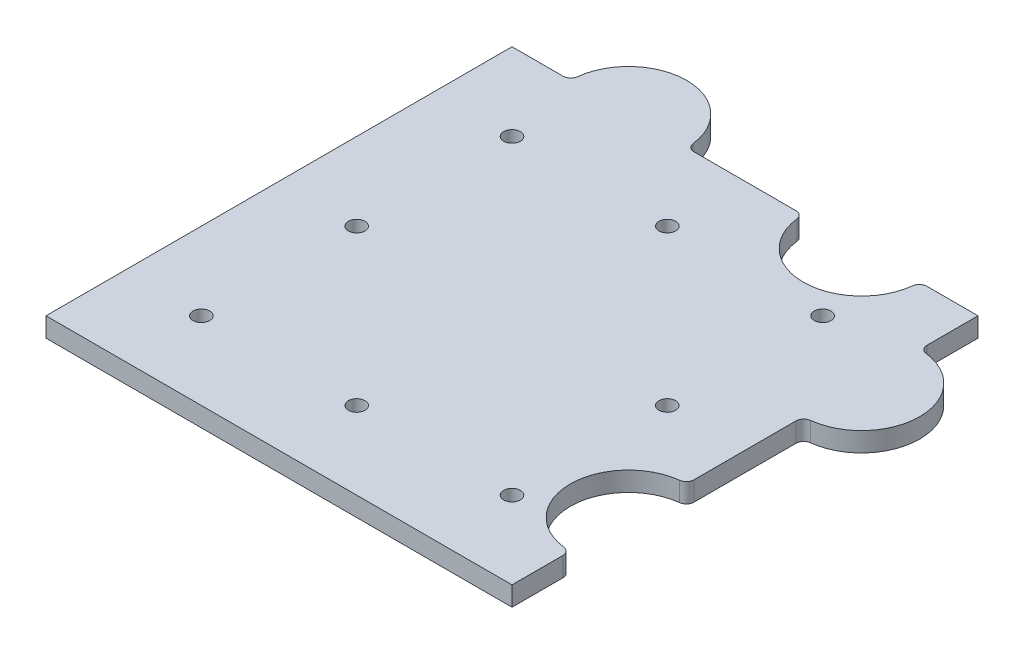
ISO-10303-21;
HEADER;
FILE_DESCRIPTION(('STEP AP214'),'2;1');
FILE_NAME('part.step','',(''),(''),'','','');
FILE_SCHEMA(('AUTOMOTIVE_DESIGN { 1 0 10303 214 1 1 1 1 }'));
ENDSEC;
DATA;
#1=APPLICATION_CONTEXT('core data for automotive mechanical design processes');
#2=APPLICATION_PROTOCOL_DEFINITION('international standard','automotive_design',2000,#1);
#3=PRODUCT_CONTEXT('',#1,'mechanical');
#4=PRODUCT('Part','Part','',(#3));
#5=PRODUCT_RELATED_PRODUCT_CATEGORY('part','',(#4));
#6=PRODUCT_DEFINITION_FORMATION('','',#4);
#7=PRODUCT_DEFINITION_CONTEXT('part definition',#1,'design');
#8=PRODUCT_DEFINITION('design','',#6,#7);
#9=PRODUCT_DEFINITION_SHAPE('','',#8);
#10=(LENGTH_UNIT() NAMED_UNIT(*) SI_UNIT(.MILLI.,.METRE.));
#11=(NAMED_UNIT(*) PLANE_ANGLE_UNIT() SI_UNIT($,.RADIAN.));
#12=(NAMED_UNIT(*) SI_UNIT($,.STERADIAN.) SOLID_ANGLE_UNIT());
#13=UNCERTAINTY_MEASURE_WITH_UNIT(LENGTH_MEASURE(1.E-05),#10,'distance_accuracy_value','');
#14=(GEOMETRIC_REPRESENTATION_CONTEXT(3) GLOBAL_UNCERTAINTY_ASSIGNED_CONTEXT((#13)) GLOBAL_UNIT_ASSIGNED_CONTEXT((#10,
#11,#12)) REPRESENTATION_CONTEXT('',''));
#15=CARTESIAN_POINT('',(0.,0.,0.));
#16=DIRECTION('',(0.,0.,1.));
#17=DIRECTION('',(1.,0.,0.));
#18=AXIS2_PLACEMENT_3D('',#15,#16,#17);
#19=CARTESIAN_POINT('',(-30.,5.,-60.));
#20=DIRECTION('',(0.,-1.,0.));
#21=DIRECTION('',(0.,0.,-1.));
#22=AXIS2_PLACEMENT_3D('',#19,#20,#21);
#23=PLANE('',#22);
#24=CARTESIAN_POINT('',(30.,5.,-60.));
#25=DIRECTION('',(0.,-1.,0.));
#26=DIRECTION('',(0.,0.,1.));
#27=AXIS2_PLACEMENT_3D('',#24,#25,#26);
#28=CIRCLE('',#27,15.);
#29=CARTESIAN_POINT('',(44.8958320730595,5.,-58.2352941176471));
#30=VERTEX_POINT('',#29);
#31=CARTESIAN_POINT('',(15.1041679269405,5.,-58.2352941176471));
#32=VERTEX_POINT('',#31);
#33=EDGE_CURVE('E208',#30,#32,#28,.T.);
#34=ORIENTED_EDGE('',*,*,#33,.T.);
#35=CARTESIAN_POINT('',(13.1180569838659,5.,-58.));
#36=DIRECTION('',(0.,-1.,0.));
#37=DIRECTION('',(0.,0.,-1.));
#38=AXIS2_PLACEMENT_3D('',#35,#36,#37);
#39=CIRCLE('',#38,2.);
#40=CARTESIAN_POINT('',(13.1180569838659,5.,-60.));
#41=VERTEX_POINT('',#40);
#42=EDGE_CURVE('E331',#32,#41,#39,.F.);
#43=ORIENTED_EDGE('',*,*,#42,.T.);
#44=DIRECTION('',(-1.,0.,0.));
#45=VECTOR('',#44,1.);
#46=CARTESIAN_POINT('',(-15.,5.,-60.));
#47=LINE('',#46,#45);
#48=CARTESIAN_POINT('',(-13.1180569838659,5.,-60.));
#49=VERTEX_POINT('',#48);
#50=EDGE_CURVE('E211',#41,#49,#47,.T.);
#51=ORIENTED_EDGE('',*,*,#50,.T.);
#52=CARTESIAN_POINT('',(-13.1180569838659,5.,-62.));
#53=DIRECTION('',(0.,-1.,0.));
#54=DIRECTION('',(0.,0.,-1.));
#55=AXIS2_PLACEMENT_3D('',#52,#53,#54);
#56=CIRCLE('',#55,2.);
#57=CARTESIAN_POINT('',(-15.1041679269405,5.,-61.7647058823529));
#58=VERTEX_POINT('',#57);
#59=EDGE_CURVE('E372',#49,#58,#56,.T.);
#60=ORIENTED_EDGE('',*,*,#59,.T.);
#61=CARTESIAN_POINT('',(-30.,5.,-60.));
#62=DIRECTION('',(0.,1.,0.));
#63=DIRECTION('',(0.,0.,-1.));
#64=AXIS2_PLACEMENT_3D('',#61,#62,#63);
#65=CIRCLE('',#64,15.);
#66=CARTESIAN_POINT('',(-44.8958320730595,5.,-61.7647058823529));
#67=VERTEX_POINT('',#66);
#68=EDGE_CURVE('E218',#58,#67,#65,.T.);
#69=ORIENTED_EDGE('',*,*,#68,.T.);
#70=CARTESIAN_POINT('',(-46.8819430161341,5.,-62.));
#71=DIRECTION('',(0.,-1.,0.));
#72=DIRECTION('',(0.,0.,-1.));
#73=AXIS2_PLACEMENT_3D('',#70,#71,#72);
#74=CIRCLE('',#73,2.);
#75=CARTESIAN_POINT('',(-46.8819430161341,5.,-60.));
#76=VERTEX_POINT('',#75);
#77=EDGE_CURVE('E366',#67,#76,#74,.T.);
#78=ORIENTED_EDGE('',*,*,#77,.T.);
#79=DIRECTION('',(-1.,0.,0.));
#80=VECTOR('',#79,1.);
#81=CARTESIAN_POINT('',(-60.,5.,-60.));
#82=LINE('',#81,#80);
#83=CARTESIAN_POINT('',(-60.,5.,-60.));
#84=VERTEX_POINT('',#83);
#85=EDGE_CURVE('E222',#76,#84,#82,.T.);
#86=ORIENTED_EDGE('',*,*,#85,.T.);
#87=DIRECTION('',(0.,0.,1.));
#88=VECTOR('',#87,1.);
#89=CARTESIAN_POINT('',(-60.,5.,60.));
#90=LINE('',#89,#88);
#91=CARTESIAN_POINT('',(-60.,5.,60.));
#92=VERTEX_POINT('',#91);
#93=EDGE_CURVE('E225',#84,#92,#90,.T.);
#94=ORIENTED_EDGE('',*,*,#93,.T.);
#95=DIRECTION('',(1.,0.,0.));
#96=VECTOR('',#95,1.);
#97=CARTESIAN_POINT('',(60.,5.,60.));
#98=LINE('',#97,#96);
#99=CARTESIAN_POINT('',(60.,5.,60.));
#100=VERTEX_POINT('',#99);
#101=EDGE_CURVE('E228',#92,#100,#98,.T.);
#102=ORIENTED_EDGE('',*,*,#101,.T.);
#103=DIRECTION('',(0.,0.,-1.));
#104=VECTOR('',#103,1.);
#105=CARTESIAN_POINT('',(60.,5.,45.));
#106=LINE('',#105,#104);
#107=CARTESIAN_POINT('',(60.,5.,46.8819430161341));
#108=VERTEX_POINT('',#107);
#109=EDGE_CURVE('E275',#100,#108,#106,.T.);
#110=ORIENTED_EDGE('',*,*,#109,.T.);
#111=CARTESIAN_POINT('',(58.,5.,46.8819430161341));
#112=DIRECTION('',(0.,-1.,0.));
#113=DIRECTION('',(0.,0.,-1.));
#114=AXIS2_PLACEMENT_3D('',#111,#112,#113);
#115=CIRCLE('',#114,2.);
#116=CARTESIAN_POINT('',(58.235294117647,5.,44.8958320730595));
#117=VERTEX_POINT('',#116);
#118=EDGE_CURVE('E322',#108,#117,#115,.F.);
#119=ORIENTED_EDGE('',*,*,#118,.T.);
#120=CARTESIAN_POINT('',(60.,5.,30.));
#121=DIRECTION('',(0.,-1.,0.));
#122=DIRECTION('',(0.,0.,1.));
#123=AXIS2_PLACEMENT_3D('',#120,#121,#122);
#124=CIRCLE('',#123,15.);
#125=CARTESIAN_POINT('',(58.235294117647,5.,15.1041679269405));
#126=VERTEX_POINT('',#125);
#127=EDGE_CURVE('E403',#117,#126,#124,.T.);
#128=ORIENTED_EDGE('',*,*,#127,.T.);
#129=CARTESIAN_POINT('',(58.,5.,13.1180569838659));
#130=DIRECTION('',(0.,-1.,0.));
#131=DIRECTION('',(0.,0.,-1.));
#132=AXIS2_PLACEMENT_3D('',#129,#130,#131);
#133=CIRCLE('',#132,2.);
#134=CARTESIAN_POINT('',(60.,5.,13.1180569838659));
#135=VERTEX_POINT('',#134);
#136=EDGE_CURVE('E325',#126,#135,#133,.F.);
#137=ORIENTED_EDGE('',*,*,#136,.T.);
#138=DIRECTION('',(0.,0.,-1.));
#139=VECTOR('',#138,1.);
#140=CARTESIAN_POINT('',(60.,5.,-15.));
#141=LINE('',#140,#139);
#142=CARTESIAN_POINT('',(60.,5.,-13.1180569838659));
#143=VERTEX_POINT('',#142);
#144=EDGE_CURVE('E397',#135,#143,#141,.T.);
#145=ORIENTED_EDGE('',*,*,#144,.T.);
#146=CARTESIAN_POINT('',(62.,5.,-13.1180569838659));
#147=DIRECTION('',(0.,-1.,0.));
#148=DIRECTION('',(0.,0.,-1.));
#149=AXIS2_PLACEMENT_3D('',#146,#147,#148);
#150=CIRCLE('',#149,2.);
#151=CARTESIAN_POINT('',(61.7647058823529,5.,-15.1041679269405));
#152=VERTEX_POINT('',#151);
#153=EDGE_CURVE('E11',#143,#152,#150,.T.);
#154=ORIENTED_EDGE('',*,*,#153,.T.);
#155=CARTESIAN_POINT('',(60.,5.,-30.));
#156=DIRECTION('',(0.,1.,0.));
#157=DIRECTION('',(0.,0.,-1.));
#158=AXIS2_PLACEMENT_3D('',#155,#156,#157);
#159=CIRCLE('',#158,15.);
#160=CARTESIAN_POINT('',(61.7647058823529,5.,-44.8958320730595));
#161=VERTEX_POINT('',#160);
#162=EDGE_CURVE('E194',#152,#161,#159,.T.);
#163=ORIENTED_EDGE('',*,*,#162,.T.);
#164=CARTESIAN_POINT('',(62.,5.,-46.8819430161341));
#165=DIRECTION('',(0.,-1.,0.));
#166=DIRECTION('',(0.,0.,-1.));
#167=AXIS2_PLACEMENT_3D('',#164,#165,#166);
#168=CIRCLE('',#167,2.);
#169=CARTESIAN_POINT('',(60.,5.,-46.8819430161341));
#170=VERTEX_POINT('',#169);
#171=EDGE_CURVE('E71',#161,#170,#168,.T.);
#172=ORIENTED_EDGE('',*,*,#171,.T.);
#173=DIRECTION('',(0.,0.,-1.));
#174=VECTOR('',#173,1.);
#175=CARTESIAN_POINT('',(60.,5.,-45.));
#176=LINE('',#175,#174);
#177=CARTESIAN_POINT('',(60.,5.,-60.));
#178=VERTEX_POINT('',#177);
#179=EDGE_CURVE('E184',#170,#178,#176,.T.);
#180=ORIENTED_EDGE('',*,*,#179,.T.);
#181=DIRECTION('',(-1.,0.,0.));
#182=VECTOR('',#181,1.);
#183=CARTESIAN_POINT('',(45.,5.,-60.));
#184=LINE('',#183,#182);
#185=CARTESIAN_POINT('',(46.8819430161341,5.,-60.));
#186=VERTEX_POINT('',#185);
#187=EDGE_CURVE('E188',#178,#186,#184,.T.);
#188=ORIENTED_EDGE('',*,*,#187,.T.);
#189=CARTESIAN_POINT('',(46.8819430161341,5.,-58.));
#190=DIRECTION('',(0.,-1.,0.));
#191=DIRECTION('',(0.,0.,-1.));
#192=AXIS2_PLACEMENT_3D('',#189,#190,#191);
#193=CIRCLE('',#192,2.);
#194=EDGE_CURVE('E328',#186,#30,#193,.F.);
#195=ORIENTED_EDGE('',*,*,#194,.T.);
#196=EDGE_LOOP('',(#34,#43,#51,#60,#69,#78,#86,#94,#102,#110,#119,#128,#137,#145,#154,#163,#172,
#180,#188,#195));
#197=FACE_BOUND('',#196,.T.);
#198=CARTESIAN_POINT('',(40.,5.,40.));
#199=DIRECTION('',(0.,1.,0.));
#200=DIRECTION('',(0.,0.,1.));
#201=AXIS2_PLACEMENT_3D('',#198,#199,#200);
#202=CIRCLE('',#201,2.15);
#203=CARTESIAN_POINT('',(40.,5.,42.15));
#204=VERTEX_POINT('',#203);
#205=EDGE_CURVE('E237',#204,#204,#202,.T.);
#206=ORIENTED_EDGE('',*,*,#205,.F.);
#207=EDGE_LOOP('',(#206));
#208=FACE_BOUND('',#207,.T.);
#209=CARTESIAN_POINT('',(-40.,5.,40.));
#210=DIRECTION('',(0.,1.,0.));
#211=DIRECTION('',(0.,0.,1.));
#212=AXIS2_PLACEMENT_3D('',#209,#210,#211);
#213=CIRCLE('',#212,2.15);
#214=CARTESIAN_POINT('',(-40.,5.,42.15));
#215=VERTEX_POINT('',#214);
#216=EDGE_CURVE('E416',#215,#215,#213,.T.);
#217=ORIENTED_EDGE('',*,*,#216,.F.);
#218=EDGE_LOOP('',(#217));
#219=FACE_BOUND('',#218,.T.);
#220=CARTESIAN_POINT('',(40.,5.,-40.));
#221=DIRECTION('',(0.,1.,0.));
#222=DIRECTION('',(0.,0.,1.));
#223=AXIS2_PLACEMENT_3D('',#220,#221,#222);
#224=CIRCLE('',#223,2.15);
#225=CARTESIAN_POINT('',(40.,5.,-37.85));
#226=VERTEX_POINT('',#225);
#227=EDGE_CURVE('E424',#226,#226,#224,.T.);
#228=ORIENTED_EDGE('',*,*,#227,.F.);
#229=EDGE_LOOP('',(#228));
#230=FACE_BOUND('',#229,.T.);
#231=CARTESIAN_POINT('',(-40.,5.,-40.));
#232=DIRECTION('',(0.,1.,0.));
#233=DIRECTION('',(0.,0.,1.));
#234=AXIS2_PLACEMENT_3D('',#231,#232,#233);
#235=CIRCLE('',#234,2.15);
#236=CARTESIAN_POINT('',(-40.,5.,-37.85));
#237=VERTEX_POINT('',#236);
#238=EDGE_CURVE('E432',#237,#237,#235,.T.);
#239=ORIENTED_EDGE('',*,*,#238,.F.);
#240=EDGE_LOOP('',(#239));
#241=FACE_BOUND('',#240,.T.);
#242=CARTESIAN_POINT('',(40.,5.,0.));
#243=DIRECTION('',(0.,1.,0.));
#244=DIRECTION('',(0.,0.,1.));
#245=AXIS2_PLACEMENT_3D('',#242,#243,#244);
#246=CIRCLE('',#245,2.15);
#247=CARTESIAN_POINT('',(40.,5.,2.15000000000002));
#248=VERTEX_POINT('',#247);
#249=EDGE_CURVE('E440',#248,#248,#246,.T.);
#250=ORIENTED_EDGE('',*,*,#249,.F.);
#251=EDGE_LOOP('',(#250));
#252=FACE_BOUND('',#251,.T.);
#253=CARTESIAN_POINT('',(0.,5.,-40.));
#254=DIRECTION('',(0.,1.,0.));
#255=DIRECTION('',(0.,0.,1.));
#256=AXIS2_PLACEMENT_3D('',#253,#254,#255);
#257=CIRCLE('',#256,2.15);
#258=CARTESIAN_POINT('',(0.,5.,-37.85));
#259=VERTEX_POINT('',#258);
#260=EDGE_CURVE('E448',#259,#259,#257,.T.);
#261=ORIENTED_EDGE('',*,*,#260,.F.);
#262=EDGE_LOOP('',(#261));
#263=FACE_BOUND('',#262,.T.);
#264=CARTESIAN_POINT('',(-40.,5.,0.));
#265=DIRECTION('',(0.,1.,0.));
#266=DIRECTION('',(0.,0.,1.));
#267=AXIS2_PLACEMENT_3D('',#264,#265,#266);
#268=CIRCLE('',#267,2.15);
#269=CARTESIAN_POINT('',(-40.,5.,2.15000000000002));
#270=VERTEX_POINT('',#269);
#271=EDGE_CURVE('E456',#270,#270,#268,.T.);
#272=ORIENTED_EDGE('',*,*,#271,.F.);
#273=EDGE_LOOP('',(#272));
#274=FACE_BOUND('',#273,.T.);
#275=CARTESIAN_POINT('',(0.,5.,40.));
#276=DIRECTION('',(0.,1.,0.));
#277=DIRECTION('',(0.,0.,1.));
#278=AXIS2_PLACEMENT_3D('',#275,#276,#277);
#279=CIRCLE('',#278,2.15);
#280=CARTESIAN_POINT('',(0.,5.,42.15));
#281=VERTEX_POINT('',#280);
#282=EDGE_CURVE('E464',#281,#281,#279,.T.);
#283=ORIENTED_EDGE('',*,*,#282,.F.);
#284=EDGE_LOOP('',(#283));
#285=FACE_BOUND('',#284,.T.);
#286=ADVANCED_FACE('F47',(#197,#208,#219,#230,#241,#252,#263,#274,#285),#23,.F.);
#287=CARTESIAN_POINT('',(-30.,0.,-60.));
#288=DIRECTION('',(0.,-1.,0.));
#289=DIRECTION('',(0.,0.,-1.));
#290=AXIS2_PLACEMENT_3D('',#287,#288,#289);
#291=PLANE('',#290);
#292=CARTESIAN_POINT('',(-40.,0.,0.));
#293=DIRECTION('',(0.,1.,0.));
#294=DIRECTION('',(0.,0.,1.));
#295=AXIS2_PLACEMENT_3D('',#292,#293,#294);
#296=CIRCLE('',#295,2.15);
#297=CARTESIAN_POINT('',(-40.,0.,2.15000000000002));
#298=VERTEX_POINT('',#297);
#299=EDGE_CURVE('E460',#298,#298,#296,.T.);
#300=ORIENTED_EDGE('',*,*,#299,.T.);
#301=EDGE_LOOP('',(#300));
#302=FACE_BOUND('',#301,.T.);
#303=CARTESIAN_POINT('',(40.,0.,0.));
#304=DIRECTION('',(0.,1.,0.));
#305=DIRECTION('',(0.,0.,1.));
#306=AXIS2_PLACEMENT_3D('',#303,#304,#305);
#307=CIRCLE('',#306,2.15);
#308=CARTESIAN_POINT('',(40.,0.,2.15000000000002));
#309=VERTEX_POINT('',#308);
#310=EDGE_CURVE('E444',#309,#309,#307,.T.);
#311=ORIENTED_EDGE('',*,*,#310,.T.);
#312=EDGE_LOOP('',(#311));
#313=FACE_BOUND('',#312,.T.);
#314=CARTESIAN_POINT('',(40.,0.,-40.));
#315=DIRECTION('',(0.,1.,0.));
#316=DIRECTION('',(0.,0.,1.));
#317=AXIS2_PLACEMENT_3D('',#314,#315,#316);
#318=CIRCLE('',#317,2.15);
#319=CARTESIAN_POINT('',(40.,0.,-37.85));
#320=VERTEX_POINT('',#319);
#321=EDGE_CURVE('E428',#320,#320,#318,.T.);
#322=ORIENTED_EDGE('',*,*,#321,.T.);
#323=EDGE_LOOP('',(#322));
#324=FACE_BOUND('',#323,.T.);
#325=CARTESIAN_POINT('',(40.,0.,40.));
#326=DIRECTION('',(0.,1.,0.));
#327=DIRECTION('',(0.,0.,1.));
#328=AXIS2_PLACEMENT_3D('',#325,#326,#327);
#329=CIRCLE('',#328,2.15);
#330=CARTESIAN_POINT('',(40.,0.,42.15));
#331=VERTEX_POINT('',#330);
#332=EDGE_CURVE('E412',#331,#331,#329,.T.);
#333=ORIENTED_EDGE('',*,*,#332,.T.);
#334=EDGE_LOOP('',(#333));
#335=FACE_BOUND('',#334,.T.);
#336=DIRECTION('',(-1.,0.,0.));
#337=VECTOR('',#336,1.);
#338=CARTESIAN_POINT('',(-15.,0.,-60.));
#339=LINE('',#338,#337);
#340=CARTESIAN_POINT('',(13.1180569838659,0.,-60.));
#341=VERTEX_POINT('',#340);
#342=CARTESIAN_POINT('',(-13.1180569838659,0.,-60.));
#343=VERTEX_POINT('',#342);
#344=EDGE_CURVE('E258',#341,#343,#339,.T.);
#345=ORIENTED_EDGE('',*,*,#344,.F.);
#346=CARTESIAN_POINT('',(13.1180569838659,0.,-58.));
#347=DIRECTION('',(0.,-1.,0.));
#348=DIRECTION('',(0.,0.,-1.));
#349=AXIS2_PLACEMENT_3D('',#346,#347,#348);
#350=CIRCLE('',#349,2.);
#351=CARTESIAN_POINT('',(15.1041679269405,0.,-58.2352941176471));
#352=VERTEX_POINT('',#351);
#353=EDGE_CURVE('E312',#341,#352,#350,.T.);
#354=ORIENTED_EDGE('',*,*,#353,.T.);
#355=CARTESIAN_POINT('',(30.,0.,-60.));
#356=DIRECTION('',(0.,-1.,0.));
#357=DIRECTION('',(0.,0.,1.));
#358=AXIS2_PLACEMENT_3D('',#355,#356,#357);
#359=CIRCLE('',#358,15.);
#360=CARTESIAN_POINT('',(44.8958320730595,0.,-58.2352941176471));
#361=VERTEX_POINT('',#360);
#362=EDGE_CURVE('E254',#361,#352,#359,.T.);
#363=ORIENTED_EDGE('',*,*,#362,.F.);
#364=CARTESIAN_POINT('',(46.8819430161341,0.,-58.));
#365=DIRECTION('',(0.,-1.,0.));
#366=DIRECTION('',(0.,0.,-1.));
#367=AXIS2_PLACEMENT_3D('',#364,#365,#366);
#368=CIRCLE('',#367,2.);
#369=CARTESIAN_POINT('',(46.8819430161341,0.,-60.));
#370=VERTEX_POINT('',#369);
#371=EDGE_CURVE('E309',#361,#370,#368,.T.);
#372=ORIENTED_EDGE('',*,*,#371,.T.);
#373=DIRECTION('',(-1.,0.,0.));
#374=VECTOR('',#373,1.);
#375=CARTESIAN_POINT('',(45.,0.,-60.));
#376=LINE('',#375,#374);
#377=CARTESIAN_POINT('',(60.,0.,-60.));
#378=VERTEX_POINT('',#377);
#379=EDGE_CURVE('E251',#378,#370,#376,.T.);
#380=ORIENTED_EDGE('',*,*,#379,.F.);
#381=DIRECTION('',(0.,0.,-1.));
#382=VECTOR('',#381,1.);
#383=CARTESIAN_POINT('',(60.,0.,-45.));
#384=LINE('',#383,#382);
#385=CARTESIAN_POINT('',(60.,0.,-46.8819430161341));
#386=VERTEX_POINT('',#385);
#387=EDGE_CURVE('E200',#386,#378,#384,.T.);
#388=ORIENTED_EDGE('',*,*,#387,.F.);
#389=CARTESIAN_POINT('',(62.,0.,-46.8819430161341));
#390=DIRECTION('',(0.,-1.,0.));
#391=DIRECTION('',(0.,0.,-1.));
#392=AXIS2_PLACEMENT_3D('',#389,#390,#391);
#393=CIRCLE('',#392,2.);
#394=CARTESIAN_POINT('',(61.7647058823529,0.,-44.8958320730595));
#395=VERTEX_POINT('',#394);
#396=EDGE_CURVE('E375',#386,#395,#393,.F.);
#397=ORIENTED_EDGE('',*,*,#396,.T.);
#398=CARTESIAN_POINT('',(60.,0.,-30.));
#399=DIRECTION('',(0.,1.,0.));
#400=DIRECTION('',(0.,0.,-1.));
#401=AXIS2_PLACEMENT_3D('',#398,#399,#400);
#402=CIRCLE('',#401,15.);
#403=CARTESIAN_POINT('',(61.7647058823529,0.,-15.1041679269405));
#404=VERTEX_POINT('',#403);
#405=EDGE_CURVE('E245',#404,#395,#402,.T.);
#406=ORIENTED_EDGE('',*,*,#405,.F.);
#407=CARTESIAN_POINT('',(62.,0.,-13.1180569838659));
#408=DIRECTION('',(0.,-1.,0.));
#409=DIRECTION('',(0.,0.,-1.));
#410=AXIS2_PLACEMENT_3D('',#407,#408,#409);
#411=CIRCLE('',#410,2.);
#412=CARTESIAN_POINT('',(60.,0.,-13.1180569838659));
#413=VERTEX_POINT('',#412);
#414=EDGE_CURVE('E56',#404,#413,#411,.F.);
#415=ORIENTED_EDGE('',*,*,#414,.T.);
#416=DIRECTION('',(0.,0.,-1.));
#417=VECTOR('',#416,1.);
#418=CARTESIAN_POINT('',(60.,0.,-15.));
#419=LINE('',#418,#417);
#420=CARTESIAN_POINT('',(60.,0.,13.1180569838659));
#421=VERTEX_POINT('',#420);
#422=EDGE_CURVE('E241',#421,#413,#419,.T.);
#423=ORIENTED_EDGE('',*,*,#422,.F.);
#424=CARTESIAN_POINT('',(58.,0.,13.1180569838659));
#425=DIRECTION('',(0.,-1.,0.));
#426=DIRECTION('',(0.,0.,-1.));
#427=AXIS2_PLACEMENT_3D('',#424,#425,#426);
#428=CIRCLE('',#427,2.);
#429=CARTESIAN_POINT('',(58.235294117647,0.,15.1041679269405));
#430=VERTEX_POINT('',#429);
#431=EDGE_CURVE('E306',#421,#430,#428,.T.);
#432=ORIENTED_EDGE('',*,*,#431,.T.);
#433=CARTESIAN_POINT('',(60.,0.,30.));
#434=DIRECTION('',(0.,-1.,0.));
#435=DIRECTION('',(0.,0.,1.));
#436=AXIS2_PLACEMENT_3D('',#433,#434,#435);
#437=CIRCLE('',#436,15.);
#438=CARTESIAN_POINT('',(58.235294117647,0.,44.8958320730595));
#439=VERTEX_POINT('',#438);
#440=EDGE_CURVE('E236',#439,#430,#437,.T.);
#441=ORIENTED_EDGE('',*,*,#440,.F.);
#442=CARTESIAN_POINT('',(58.,0.,46.8819430161341));
#443=DIRECTION('',(0.,-1.,0.));
#444=DIRECTION('',(0.,0.,-1.));
#445=AXIS2_PLACEMENT_3D('',#442,#443,#444);
#446=CIRCLE('',#445,2.);
#447=CARTESIAN_POINT('',(60.,0.,46.8819430161341));
#448=VERTEX_POINT('',#447);
#449=EDGE_CURVE('E303',#439,#448,#446,.T.);
#450=ORIENTED_EDGE('',*,*,#449,.T.);
#451=DIRECTION('',(0.,0.,-1.));
#452=VECTOR('',#451,1.);
#453=CARTESIAN_POINT('',(60.,0.,45.));
#454=LINE('',#453,#452);
#455=CARTESIAN_POINT('',(60.,0.,60.));
#456=VERTEX_POINT('',#455);
#457=EDGE_CURVE('E232',#456,#448,#454,.T.);
#458=ORIENTED_EDGE('',*,*,#457,.F.);
#459=DIRECTION('',(1.,0.,0.));
#460=VECTOR('',#459,1.);
#461=CARTESIAN_POINT('',(60.,0.,60.));
#462=LINE('',#461,#460);
#463=CARTESIAN_POINT('',(-60.,0.,60.));
#464=VERTEX_POINT('',#463);
#465=EDGE_CURVE('E272',#464,#456,#462,.T.);
#466=ORIENTED_EDGE('',*,*,#465,.F.);
#467=DIRECTION('',(0.,0.,1.));
#468=VECTOR('',#467,1.);
#469=CARTESIAN_POINT('',(-60.,0.,60.));
#470=LINE('',#469,#468);
#471=CARTESIAN_POINT('',(-60.,0.,-60.));
#472=VERTEX_POINT('',#471);
#473=EDGE_CURVE('E269',#472,#464,#470,.T.);
#474=ORIENTED_EDGE('',*,*,#473,.F.);
#475=DIRECTION('',(-1.,0.,0.));
#476=VECTOR('',#475,1.);
#477=CARTESIAN_POINT('',(-60.,0.,-60.));
#478=LINE('',#477,#476);
#479=CARTESIAN_POINT('',(-46.8819430161341,0.,-60.));
#480=VERTEX_POINT('',#479);
#481=EDGE_CURVE('E266',#480,#472,#478,.T.);
#482=ORIENTED_EDGE('',*,*,#481,.F.);
#483=CARTESIAN_POINT('',(-46.8819430161341,0.,-62.));
#484=DIRECTION('',(0.,-1.,0.));
#485=DIRECTION('',(0.,0.,-1.));
#486=AXIS2_PLACEMENT_3D('',#483,#484,#485);
#487=CIRCLE('',#486,2.);
#488=CARTESIAN_POINT('',(-44.8958320730595,0.,-61.7647058823529));
#489=VERTEX_POINT('',#488);
#490=EDGE_CURVE('E363',#480,#489,#487,.F.);
#491=ORIENTED_EDGE('',*,*,#490,.T.);
#492=CARTESIAN_POINT('',(-30.,0.,-60.));
#493=DIRECTION('',(0.,1.,0.));
#494=DIRECTION('',(0.,0.,-1.));
#495=AXIS2_PLACEMENT_3D('',#492,#493,#494);
#496=CIRCLE('',#495,15.);
#497=CARTESIAN_POINT('',(-15.1041679269405,0.,-61.7647058823529));
#498=VERTEX_POINT('',#497);
#499=EDGE_CURVE('E262',#498,#489,#496,.T.);
#500=ORIENTED_EDGE('',*,*,#499,.F.);
#501=CARTESIAN_POINT('',(-13.1180569838659,0.,-62.));
#502=DIRECTION('',(0.,-1.,0.));
#503=DIRECTION('',(0.,0.,-1.));
#504=AXIS2_PLACEMENT_3D('',#501,#502,#503);
#505=CIRCLE('',#504,2.);
#506=EDGE_CURVE('E369',#498,#343,#505,.F.);
#507=ORIENTED_EDGE('',*,*,#506,.T.);
#508=EDGE_LOOP('',(#345,#354,#363,#372,#380,#388,#397,#406,#415,#423,#432,#441,#450,#458,#466,
#474,#482,#491,#500,#507));
#509=FACE_BOUND('',#508,.T.);
#510=CARTESIAN_POINT('',(-40.,0.,40.));
#511=DIRECTION('',(0.,1.,0.));
#512=DIRECTION('',(0.,0.,1.));
#513=AXIS2_PLACEMENT_3D('',#510,#511,#512);
#514=CIRCLE('',#513,2.15);
#515=CARTESIAN_POINT('',(-40.,0.,42.15));
#516=VERTEX_POINT('',#515);
#517=EDGE_CURVE('E420',#516,#516,#514,.T.);
#518=ORIENTED_EDGE('',*,*,#517,.T.);
#519=EDGE_LOOP('',(#518));
#520=FACE_BOUND('',#519,.T.);
#521=CARTESIAN_POINT('',(-40.,0.,-40.));
#522=DIRECTION('',(0.,1.,0.));
#523=DIRECTION('',(0.,0.,1.));
#524=AXIS2_PLACEMENT_3D('',#521,#522,#523);
#525=CIRCLE('',#524,2.15);
#526=CARTESIAN_POINT('',(-40.,0.,-37.85));
#527=VERTEX_POINT('',#526);
#528=EDGE_CURVE('E436',#527,#527,#525,.T.);
#529=ORIENTED_EDGE('',*,*,#528,.T.);
#530=EDGE_LOOP('',(#529));
#531=FACE_BOUND('',#530,.T.);
#532=CARTESIAN_POINT('',(0.,0.,-40.));
#533=DIRECTION('',(0.,1.,0.));
#534=DIRECTION('',(0.,0.,1.));
#535=AXIS2_PLACEMENT_3D('',#532,#533,#534);
#536=CIRCLE('',#535,2.15);
#537=CARTESIAN_POINT('',(0.,0.,-37.85));
#538=VERTEX_POINT('',#537);
#539=EDGE_CURVE('E452',#538,#538,#536,.T.);
#540=ORIENTED_EDGE('',*,*,#539,.T.);
#541=EDGE_LOOP('',(#540));
#542=FACE_BOUND('',#541,.T.);
#543=CARTESIAN_POINT('',(0.,0.,40.));
#544=DIRECTION('',(0.,1.,0.));
#545=DIRECTION('',(0.,0.,1.));
#546=AXIS2_PLACEMENT_3D('',#543,#544,#545);
#547=CIRCLE('',#546,2.15);
#548=CARTESIAN_POINT('',(0.,0.,42.15));
#549=VERTEX_POINT('',#548);
#550=EDGE_CURVE('E468',#549,#549,#547,.T.);
#551=ORIENTED_EDGE('',*,*,#550,.T.);
#552=EDGE_LOOP('',(#551));
#553=FACE_BOUND('',#552,.T.);
#554=ADVANCED_FACE('F384',(#302,#313,#324,#335,#509,#520,#531,#542,#553),#291,.T.);
#555=CARTESIAN_POINT('',(60.,5.,45.));
#556=DIRECTION('',(-1.,0.,0.));
#557=DIRECTION('',(0.,0.,1.));
#558=AXIS2_PLACEMENT_3D('',#555,#556,#557);
#559=PLANE('',#558);
#560=ORIENTED_EDGE('',*,*,#457,.T.);
#561=DIRECTION('',(0.,-1.,0.));
#562=VECTOR('',#561,1.);
#563=CARTESIAN_POINT('',(60.,5.,46.8819430161341));
#564=LINE('',#563,#562);
#565=EDGE_CURVE('E360',#448,#108,#564,.F.);
#566=ORIENTED_EDGE('',*,*,#565,.T.);
#567=ORIENTED_EDGE('',*,*,#109,.F.);
#568=DIRECTION('',(0.,-1.,0.));
#569=VECTOR('',#568,1.);
#570=CARTESIAN_POINT('',(60.,5.,60.));
#571=LINE('',#570,#569);
#572=EDGE_CURVE('E231',#100,#456,#571,.T.);
#573=ORIENTED_EDGE('',*,*,#572,.T.);
#574=EDGE_LOOP('',(#560,#566,#567,#573));
#575=FACE_BOUND('',#574,.T.);
#576=ADVANCED_FACE('F483',(#575),#559,.F.);
#577=CARTESIAN_POINT('',(60.,5.,30.));
#578=DIRECTION('',(0.,-1.,0.));
#579=DIRECTION('',(0.,0.,-1.));
#580=AXIS2_PLACEMENT_3D('',#577,#578,#579);
#581=CYLINDRICAL_SURFACE('',#580,15.);
#582=ORIENTED_EDGE('',*,*,#440,.T.);
#583=DIRECTION('',(0.,-1.,0.));
#584=VECTOR('',#583,1.);
#585=CARTESIAN_POINT('',(58.235294117647,5.,15.1041679269405));
#586=LINE('',#585,#584);
#587=EDGE_CURVE('E357',#430,#126,#586,.F.);
#588=ORIENTED_EDGE('',*,*,#587,.T.);
#589=ORIENTED_EDGE('',*,*,#127,.F.);
#590=DIRECTION('',(0.,-1.,0.));
#591=VECTOR('',#590,1.);
#592=CARTESIAN_POINT('',(58.235294117647,5.,44.8958320730595));
#593=LINE('',#592,#591);
#594=EDGE_CURVE('E353',#117,#439,#593,.T.);
#595=ORIENTED_EDGE('',*,*,#594,.T.);
#596=EDGE_LOOP('',(#582,#588,#589,#595));
#597=FACE_BOUND('',#596,.T.);
#598=ADVANCED_FACE('F522',(#597),#581,.F.);
#599=CARTESIAN_POINT('',(60.,5.,-15.));
#600=DIRECTION('',(-1.,0.,0.));
#601=DIRECTION('',(0.,0.,1.));
#602=AXIS2_PLACEMENT_3D('',#599,#600,#601);
#603=PLANE('',#602);
#604=ORIENTED_EDGE('',*,*,#422,.T.);
#605=DIRECTION('',(0.,1.,0.));
#606=VECTOR('',#605,1.);
#607=CARTESIAN_POINT('',(60.,5.,-13.1180569838659));
#608=LINE('',#607,#606);
#609=EDGE_CURVE('E350',#413,#143,#608,.T.);
#610=ORIENTED_EDGE('',*,*,#609,.T.);
#611=ORIENTED_EDGE('',*,*,#144,.F.);
#612=DIRECTION('',(0.,-1.,0.));
#613=VECTOR('',#612,1.);
#614=CARTESIAN_POINT('',(60.,5.,13.1180569838659));
#615=LINE('',#614,#613);
#616=EDGE_CURVE('E346',#135,#421,#615,.T.);
#617=ORIENTED_EDGE('',*,*,#616,.T.);
#618=EDGE_LOOP('',(#604,#610,#611,#617));
#619=FACE_BOUND('',#618,.T.);
#620=ADVANCED_FACE('F390',(#619),#603,.F.);
#621=CARTESIAN_POINT('',(60.,5.,-30.));
#622=DIRECTION('',(0.,-1.,0.));
#623=DIRECTION('',(0.,0.,-1.));
#624=AXIS2_PLACEMENT_3D('',#621,#622,#623);
#625=CYLINDRICAL_SURFACE('',#624,15.);
#626=ORIENTED_EDGE('',*,*,#405,.T.);
#627=DIRECTION('',(0.,-1.,0.));
#628=VECTOR('',#627,1.);
#629=CARTESIAN_POINT('',(61.7647058823529,5.,-44.8958320730595));
#630=LINE('',#629,#628);
#631=EDGE_CURVE('E343',#395,#161,#630,.F.);
#632=ORIENTED_EDGE('',*,*,#631,.T.);
#633=ORIENTED_EDGE('',*,*,#162,.F.);
#634=DIRECTION('',(0.,-1.,0.));
#635=VECTOR('',#634,1.);
#636=CARTESIAN_POINT('',(61.7647058823529,5.,-15.1041679269405));
#637=LINE('',#636,#635);
#638=EDGE_CURVE('E339',#152,#404,#637,.T.);
#639=ORIENTED_EDGE('',*,*,#638,.T.);
#640=EDGE_LOOP('',(#626,#632,#633,#639));
#641=FACE_BOUND('',#640,.T.);
#642=ADVANCED_FACE('F399',(#641),#625,.T.);
#643=CARTESIAN_POINT('',(60.,5.,-45.));
#644=DIRECTION('',(-1.,0.,0.));
#645=DIRECTION('',(0.,0.,1.));
#646=AXIS2_PLACEMENT_3D('',#643,#644,#645);
#647=PLANE('',#646);
#648=ORIENTED_EDGE('',*,*,#179,.F.);
#649=DIRECTION('',(0.,1.,0.));
#650=VECTOR('',#649,1.);
#651=CARTESIAN_POINT('',(60.,0.,-46.8819430161341));
#652=LINE('',#651,#650);
#653=EDGE_CURVE('E336',#170,#386,#652,.F.);
#654=ORIENTED_EDGE('',*,*,#653,.T.);
#655=ORIENTED_EDGE('',*,*,#387,.T.);
#656=DIRECTION('',(0.,-1.,0.));
#657=VECTOR('',#656,1.);
#658=CARTESIAN_POINT('',(60.,5.,-60.));
#659=LINE('',#658,#657);
#660=EDGE_CURVE('E197',#178,#378,#659,.T.);
#661=ORIENTED_EDGE('',*,*,#660,.F.);
#662=EDGE_LOOP('',(#648,#654,#655,#661));
#663=FACE_BOUND('',#662,.T.);
#664=ADVANCED_FACE('F198',(#663),#647,.F.);
#665=CARTESIAN_POINT('',(45.,5.,-60.));
#666=DIRECTION('',(0.,0.,1.));
#667=DIRECTION('',(1.,0.,0.));
#668=AXIS2_PLACEMENT_3D('',#665,#666,#667);
#669=PLANE('',#668);
#670=ORIENTED_EDGE('',*,*,#379,.T.);
#671=DIRECTION('',(0.,-1.,0.));
#672=VECTOR('',#671,1.);
#673=CARTESIAN_POINT('',(46.8819430161341,5.,-60.));
#674=LINE('',#673,#672);
#675=EDGE_CURVE('E63',#370,#186,#674,.F.);
#676=ORIENTED_EDGE('',*,*,#675,.T.);
#677=ORIENTED_EDGE('',*,*,#187,.F.);
#678=ORIENTED_EDGE('',*,*,#660,.T.);
#679=EDGE_LOOP('',(#670,#676,#677,#678));
#680=FACE_BOUND('',#679,.T.);
#681=ADVANCED_FACE('F206',(#680),#669,.F.);
#682=CARTESIAN_POINT('',(30.,5.,-60.));
#683=DIRECTION('',(0.,-1.,0.));
#684=DIRECTION('',(0.,0.,-1.));
#685=AXIS2_PLACEMENT_3D('',#682,#683,#684);
#686=CYLINDRICAL_SURFACE('',#685,15.);
#687=ORIENTED_EDGE('',*,*,#362,.T.);
#688=DIRECTION('',(0.,-1.,0.));
#689=VECTOR('',#688,1.);
#690=CARTESIAN_POINT('',(15.1041679269405,5.,-58.2352941176471));
#691=LINE('',#690,#689);
#692=EDGE_CURVE('E319',#352,#32,#691,.F.);
#693=ORIENTED_EDGE('',*,*,#692,.T.);
#694=ORIENTED_EDGE('',*,*,#33,.F.);
#695=DIRECTION('',(0.,-1.,0.));
#696=VECTOR('',#695,1.);
#697=CARTESIAN_POINT('',(44.8958320730595,5.,-58.2352941176471));
#698=LINE('',#697,#696);
#699=EDGE_CURVE('E315',#30,#361,#698,.T.);
#700=ORIENTED_EDGE('',*,*,#699,.T.);
#701=EDGE_LOOP('',(#687,#693,#694,#700));
#702=FACE_BOUND('',#701,.T.);
#703=ADVANCED_FACE('F509',(#702),#686,.F.);
#704=CARTESIAN_POINT('',(-15.,5.,-60.));
#705=DIRECTION('',(0.,0.,1.));
#706=DIRECTION('',(1.,0.,0.));
#707=AXIS2_PLACEMENT_3D('',#704,#705,#706);
#708=PLANE('',#707);
#709=ORIENTED_EDGE('',*,*,#344,.T.);
#710=DIRECTION('',(0.,1.,0.));
#711=VECTOR('',#710,1.);
#712=CARTESIAN_POINT('',(-13.1180569838659,5.,-60.));
#713=LINE('',#712,#711);
#714=EDGE_CURVE('E300',#343,#49,#713,.T.);
#715=ORIENTED_EDGE('',*,*,#714,.T.);
#716=ORIENTED_EDGE('',*,*,#50,.F.);
#717=DIRECTION('',(0.,-1.,0.));
#718=VECTOR('',#717,1.);
#719=CARTESIAN_POINT('',(13.1180569838659,5.,-60.));
#720=LINE('',#719,#718);
#721=EDGE_CURVE('E296',#41,#341,#720,.T.);
#722=ORIENTED_EDGE('',*,*,#721,.T.);
#723=EDGE_LOOP('',(#709,#715,#716,#722));
#724=FACE_BOUND('',#723,.T.);
#725=ADVANCED_FACE('F505',(#724),#708,.F.);
#726=CARTESIAN_POINT('',(-30.,5.,-60.));
#727=DIRECTION('',(0.,-1.,0.));
#728=DIRECTION('',(0.,0.,-1.));
#729=AXIS2_PLACEMENT_3D('',#726,#727,#728);
#730=CYLINDRICAL_SURFACE('',#729,15.);
#731=ORIENTED_EDGE('',*,*,#499,.T.);
#732=DIRECTION('',(0.,-1.,0.));
#733=VECTOR('',#732,1.);
#734=CARTESIAN_POINT('',(-44.8958320730595,5.,-61.7647058823529));
#735=LINE('',#734,#733);
#736=EDGE_CURVE('E293',#489,#67,#735,.F.);
#737=ORIENTED_EDGE('',*,*,#736,.T.);
#738=ORIENTED_EDGE('',*,*,#68,.F.);
#739=DIRECTION('',(0.,-1.,0.));
#740=VECTOR('',#739,1.);
#741=CARTESIAN_POINT('',(-15.1041679269405,5.,-61.7647058823529));
#742=LINE('',#741,#740);
#743=EDGE_CURVE('E289',#58,#498,#742,.T.);
#744=ORIENTED_EDGE('',*,*,#743,.T.);
#745=EDGE_LOOP('',(#731,#737,#738,#744));
#746=FACE_BOUND('',#745,.T.);
#747=ADVANCED_FACE('F501',(#746),#730,.T.);
#748=CARTESIAN_POINT('',(-60.,5.,-60.));
#749=DIRECTION('',(0.,0.,1.));
#750=DIRECTION('',(1.,0.,0.));
#751=AXIS2_PLACEMENT_3D('',#748,#749,#750);
#752=PLANE('',#751);
#753=ORIENTED_EDGE('',*,*,#85,.F.);
#754=DIRECTION('',(0.,1.,0.));
#755=VECTOR('',#754,1.);
#756=CARTESIAN_POINT('',(-46.8819430161341,0.,-60.));
#757=LINE('',#756,#755);
#758=EDGE_CURVE('E203',#76,#480,#757,.F.);
#759=ORIENTED_EDGE('',*,*,#758,.T.);
#760=ORIENTED_EDGE('',*,*,#481,.T.);
#761=DIRECTION('',(0.,-1.,0.));
#762=VECTOR('',#761,1.);
#763=CARTESIAN_POINT('',(-60.,5.,-60.));
#764=LINE('',#763,#762);
#765=EDGE_CURVE('E204',#84,#472,#764,.T.);
#766=ORIENTED_EDGE('',*,*,#765,.F.);
#767=EDGE_LOOP('',(#753,#759,#760,#766));
#768=FACE_BOUND('',#767,.T.);
#769=ADVANCED_FACE('F497',(#768),#752,.F.);
#770=CARTESIAN_POINT('',(-60.,5.,60.));
#771=DIRECTION('',(1.,0.,0.));
#772=DIRECTION('',(0.,0.,-1.));
#773=AXIS2_PLACEMENT_3D('',#770,#771,#772);
#774=PLANE('',#773);
#775=ORIENTED_EDGE('',*,*,#473,.T.);
#776=DIRECTION('',(0.,-1.,0.));
#777=VECTOR('',#776,1.);
#778=CARTESIAN_POINT('',(-60.,5.,60.));
#779=LINE('',#778,#777);
#780=EDGE_CURVE('E279',#92,#464,#779,.T.);
#781=ORIENTED_EDGE('',*,*,#780,.F.);
#782=ORIENTED_EDGE('',*,*,#93,.F.);
#783=ORIENTED_EDGE('',*,*,#765,.T.);
#784=EDGE_LOOP('',(#775,#781,#782,#783));
#785=FACE_BOUND('',#784,.T.);
#786=ADVANCED_FACE('F493',(#785),#774,.F.);
#787=CARTESIAN_POINT('',(60.,5.,60.));
#788=DIRECTION('',(0.,0.,-1.));
#789=DIRECTION('',(-1.,0.,0.));
#790=AXIS2_PLACEMENT_3D('',#787,#788,#789);
#791=PLANE('',#790);
#792=ORIENTED_EDGE('',*,*,#465,.T.);
#793=ORIENTED_EDGE('',*,*,#572,.F.);
#794=ORIENTED_EDGE('',*,*,#101,.F.);
#795=ORIENTED_EDGE('',*,*,#780,.T.);
#796=EDGE_LOOP('',(#792,#793,#794,#795));
#797=FACE_BOUND('',#796,.T.);
#798=ADVANCED_FACE('F490',(#797),#791,.F.);
#799=CARTESIAN_POINT('',(40.,5.,40.));
#800=DIRECTION('',(0.,-1.,0.));
#801=DIRECTION('',(0.,0.,-1.));
#802=AXIS2_PLACEMENT_3D('',#799,#800,#801);
#803=CYLINDRICAL_SURFACE('',#802,2.15);
#804=ORIENTED_EDGE('',*,*,#205,.T.);
#805=EDGE_LOOP('',(#804));
#806=FACE_BOUND('',#805,.T.);
#807=ORIENTED_EDGE('',*,*,#332,.F.);
#808=EDGE_LOOP('',(#807));
#809=FACE_BOUND('',#808,.T.);
#810=ADVANCED_FACE('F487',(#806,#809),#803,.F.);
#811=CARTESIAN_POINT('',(-40.,5.,40.));
#812=DIRECTION('',(0.,-1.,0.));
#813=DIRECTION('',(0.,0.,-1.));
#814=AXIS2_PLACEMENT_3D('',#811,#812,#813);
#815=CYLINDRICAL_SURFACE('',#814,2.15);
#816=ORIENTED_EDGE('',*,*,#216,.T.);
#817=EDGE_LOOP('',(#816));
#818=FACE_BOUND('',#817,.T.);
#819=ORIENTED_EDGE('',*,*,#517,.F.);
#820=EDGE_LOOP('',(#819));
#821=FACE_BOUND('',#820,.T.);
#822=ADVANCED_FACE('F698',(#818,#821),#815,.F.);
#823=CARTESIAN_POINT('',(40.,5.,-40.));
#824=DIRECTION('',(0.,-1.,0.));
#825=DIRECTION('',(0.,0.,-1.));
#826=AXIS2_PLACEMENT_3D('',#823,#824,#825);
#827=CYLINDRICAL_SURFACE('',#826,2.15);
#828=ORIENTED_EDGE('',*,*,#227,.T.);
#829=EDGE_LOOP('',(#828));
#830=FACE_BOUND('',#829,.T.);
#831=ORIENTED_EDGE('',*,*,#321,.F.);
#832=EDGE_LOOP('',(#831));
#833=FACE_BOUND('',#832,.T.);
#834=ADVANCED_FACE('F687',(#830,#833),#827,.F.);
#835=CARTESIAN_POINT('',(-40.,5.,-40.));
#836=DIRECTION('',(0.,-1.,0.));
#837=DIRECTION('',(0.,0.,-1.));
#838=AXIS2_PLACEMENT_3D('',#835,#836,#837);
#839=CYLINDRICAL_SURFACE('',#838,2.15);
#840=ORIENTED_EDGE('',*,*,#238,.T.);
#841=EDGE_LOOP('',(#840));
#842=FACE_BOUND('',#841,.T.);
#843=ORIENTED_EDGE('',*,*,#528,.F.);
#844=EDGE_LOOP('',(#843));
#845=FACE_BOUND('',#844,.T.);
#846=ADVANCED_FACE('F676',(#842,#845),#839,.F.);
#847=CARTESIAN_POINT('',(40.,5.,0.));
#848=DIRECTION('',(0.,-1.,0.));
#849=DIRECTION('',(0.,0.,-1.));
#850=AXIS2_PLACEMENT_3D('',#847,#848,#849);
#851=CYLINDRICAL_SURFACE('',#850,2.15);
#852=ORIENTED_EDGE('',*,*,#249,.T.);
#853=EDGE_LOOP('',(#852));
#854=FACE_BOUND('',#853,.T.);
#855=ORIENTED_EDGE('',*,*,#310,.F.);
#856=EDGE_LOOP('',(#855));
#857=FACE_BOUND('',#856,.T.);
#858=ADVANCED_FACE('F665',(#854,#857),#851,.F.);
#859=CARTESIAN_POINT('',(0.,5.,-40.));
#860=DIRECTION('',(0.,-1.,0.));
#861=DIRECTION('',(0.,0.,-1.));
#862=AXIS2_PLACEMENT_3D('',#859,#860,#861);
#863=CYLINDRICAL_SURFACE('',#862,2.15);
#864=ORIENTED_EDGE('',*,*,#260,.T.);
#865=EDGE_LOOP('',(#864));
#866=FACE_BOUND('',#865,.T.);
#867=ORIENTED_EDGE('',*,*,#539,.F.);
#868=EDGE_LOOP('',(#867));
#869=FACE_BOUND('',#868,.T.);
#870=ADVANCED_FACE('F654',(#866,#869),#863,.F.);
#871=CARTESIAN_POINT('',(-40.,5.,0.));
#872=DIRECTION('',(0.,-1.,0.));
#873=DIRECTION('',(0.,0.,-1.));
#874=AXIS2_PLACEMENT_3D('',#871,#872,#873);
#875=CYLINDRICAL_SURFACE('',#874,2.15);
#876=ORIENTED_EDGE('',*,*,#271,.T.);
#877=EDGE_LOOP('',(#876));
#878=FACE_BOUND('',#877,.T.);
#879=ORIENTED_EDGE('',*,*,#299,.F.);
#880=EDGE_LOOP('',(#879));
#881=FACE_BOUND('',#880,.T.);
#882=ADVANCED_FACE('F644',(#878,#881),#875,.F.);
#883=CARTESIAN_POINT('',(0.,5.,40.));
#884=DIRECTION('',(0.,-1.,0.));
#885=DIRECTION('',(0.,0.,-1.));
#886=AXIS2_PLACEMENT_3D('',#883,#884,#885);
#887=CYLINDRICAL_SURFACE('',#886,2.15);
#888=ORIENTED_EDGE('',*,*,#282,.T.);
#889=EDGE_LOOP('',(#888));
#890=FACE_BOUND('',#889,.T.);
#891=ORIENTED_EDGE('',*,*,#550,.F.);
#892=EDGE_LOOP('',(#891));
#893=FACE_BOUND('',#892,.T.);
#894=ADVANCED_FACE('F476',(#890,#893),#887,.F.);
#895=CARTESIAN_POINT('',(-46.8819430161341,5.,-62.));
#896=DIRECTION('',(0.,-1.,0.));
#897=DIRECTION('',(0.,0.,-1.));
#898=AXIS2_PLACEMENT_3D('',#895,#896,#897);
#899=CYLINDRICAL_SURFACE('',#898,2.);
#900=ORIENTED_EDGE('',*,*,#77,.F.);
#901=ORIENTED_EDGE('',*,*,#736,.F.);
#902=ORIENTED_EDGE('',*,*,#490,.F.);
#903=ORIENTED_EDGE('',*,*,#758,.F.);
#904=EDGE_LOOP('',(#900,#901,#902,#903));
#905=FACE_BOUND('',#904,.T.);
#906=ADVANCED_FACE('F529',(#905),#899,.F.);
#907=CARTESIAN_POINT('',(-13.1180569838659,5.,-62.));
#908=DIRECTION('',(0.,-1.,0.));
#909=DIRECTION('',(0.,0.,-1.));
#910=AXIS2_PLACEMENT_3D('',#907,#908,#909);
#911=CYLINDRICAL_SURFACE('',#910,2.);
#912=ORIENTED_EDGE('',*,*,#59,.F.);
#913=ORIENTED_EDGE('',*,*,#714,.F.);
#914=ORIENTED_EDGE('',*,*,#506,.F.);
#915=ORIENTED_EDGE('',*,*,#743,.F.);
#916=EDGE_LOOP('',(#912,#913,#914,#915));
#917=FACE_BOUND('',#916,.T.);
#918=ADVANCED_FACE('F532',(#917),#911,.F.);
#919=CARTESIAN_POINT('',(13.1180569838659,5.,-58.));
#920=DIRECTION('',(0.,-1.,0.));
#921=DIRECTION('',(0.,0.,-1.));
#922=AXIS2_PLACEMENT_3D('',#919,#920,#921);
#923=CYLINDRICAL_SURFACE('',#922,2.);
#924=ORIENTED_EDGE('',*,*,#42,.F.);
#925=ORIENTED_EDGE('',*,*,#692,.F.);
#926=ORIENTED_EDGE('',*,*,#353,.F.);
#927=ORIENTED_EDGE('',*,*,#721,.F.);
#928=EDGE_LOOP('',(#924,#925,#926,#927));
#929=FACE_BOUND('',#928,.T.);
#930=ADVANCED_FACE('F536',(#929),#923,.T.);
#931=CARTESIAN_POINT('',(46.8819430161341,5.,-58.));
#932=DIRECTION('',(0.,-1.,0.));
#933=DIRECTION('',(0.,0.,-1.));
#934=AXIS2_PLACEMENT_3D('',#931,#932,#933);
#935=CYLINDRICAL_SURFACE('',#934,2.);
#936=ORIENTED_EDGE('',*,*,#194,.F.);
#937=ORIENTED_EDGE('',*,*,#675,.F.);
#938=ORIENTED_EDGE('',*,*,#371,.F.);
#939=ORIENTED_EDGE('',*,*,#699,.F.);
#940=EDGE_LOOP('',(#936,#937,#938,#939));
#941=FACE_BOUND('',#940,.T.);
#942=ADVANCED_FACE('F540',(#941),#935,.T.);
#943=CARTESIAN_POINT('',(62.,5.,-46.8819430161341));
#944=DIRECTION('',(0.,-1.,0.));
#945=DIRECTION('',(0.,0.,-1.));
#946=AXIS2_PLACEMENT_3D('',#943,#944,#945);
#947=CYLINDRICAL_SURFACE('',#946,2.);
#948=ORIENTED_EDGE('',*,*,#171,.F.);
#949=ORIENTED_EDGE('',*,*,#631,.F.);
#950=ORIENTED_EDGE('',*,*,#396,.F.);
#951=ORIENTED_EDGE('',*,*,#653,.F.);
#952=EDGE_LOOP('',(#948,#949,#950,#951));
#953=FACE_BOUND('',#952,.T.);
#954=ADVANCED_FACE('F544',(#953),#947,.F.);
#955=CARTESIAN_POINT('',(62.,5.,-13.1180569838659));
#956=DIRECTION('',(0.,-1.,0.));
#957=DIRECTION('',(0.,0.,-1.));
#958=AXIS2_PLACEMENT_3D('',#955,#956,#957);
#959=CYLINDRICAL_SURFACE('',#958,2.);
#960=ORIENTED_EDGE('',*,*,#153,.F.);
#961=ORIENTED_EDGE('',*,*,#609,.F.);
#962=ORIENTED_EDGE('',*,*,#414,.F.);
#963=ORIENTED_EDGE('',*,*,#638,.F.);
#964=EDGE_LOOP('',(#960,#961,#962,#963));
#965=FACE_BOUND('',#964,.T.);
#966=ADVANCED_FACE('F395',(#965),#959,.F.);
#967=CARTESIAN_POINT('',(58.,5.,13.1180569838659));
#968=DIRECTION('',(0.,-1.,0.));
#969=DIRECTION('',(0.,0.,-1.));
#970=AXIS2_PLACEMENT_3D('',#967,#968,#969);
#971=CYLINDRICAL_SURFACE('',#970,2.);
#972=ORIENTED_EDGE('',*,*,#136,.F.);
#973=ORIENTED_EDGE('',*,*,#587,.F.);
#974=ORIENTED_EDGE('',*,*,#431,.F.);
#975=ORIENTED_EDGE('',*,*,#616,.F.);
#976=EDGE_LOOP('',(#972,#973,#974,#975));
#977=FACE_BOUND('',#976,.T.);
#978=ADVANCED_FACE('F550',(#977),#971,.T.);
#979=CARTESIAN_POINT('',(58.,5.,46.8819430161341));
#980=DIRECTION('',(0.,-1.,0.));
#981=DIRECTION('',(0.,0.,-1.));
#982=AXIS2_PLACEMENT_3D('',#979,#980,#981);
#983=CYLINDRICAL_SURFACE('',#982,2.);
#984=ORIENTED_EDGE('',*,*,#118,.F.);
#985=ORIENTED_EDGE('',*,*,#565,.F.);
#986=ORIENTED_EDGE('',*,*,#449,.F.);
#987=ORIENTED_EDGE('',*,*,#594,.F.);
#988=EDGE_LOOP('',(#984,#985,#986,#987));
#989=FACE_BOUND('',#988,.T.);
#990=ADVANCED_FACE('F49',(#989),#983,.T.);
#991=CLOSED_SHELL('',(#286,#554,#576,#598,#620,#642,#664,#681,#703,#725,#747,#769,#786,#798,
#810,#822,#834,#846,#858,#870,#882,#894,#906,#918,#930,#942,#954,#966,#978,#990));
#992=MANIFOLD_SOLID_BREP('B2',#991);
#993=ADVANCED_BREP_SHAPE_REPRESENTATION('',(#18,#992),#14);
#994=SHAPE_DEFINITION_REPRESENTATION(#9,#993);
ENDSEC;
END-ISO-10303-21;
